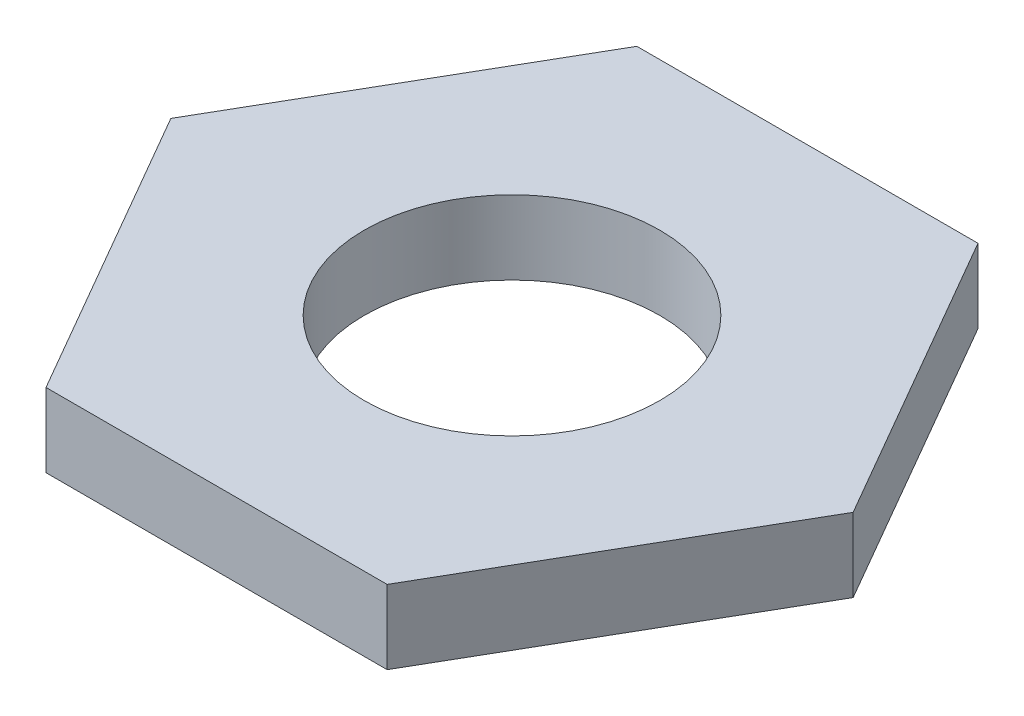
ISO-10303-21;
HEADER;
FILE_DESCRIPTION(('STEP AP214'),'2;1');
FILE_NAME('part.step','',(''),(''),'','','');
FILE_SCHEMA(('AUTOMOTIVE_DESIGN { 1 0 10303 214 1 1 1 1 }'));
ENDSEC;
DATA;
#1=APPLICATION_CONTEXT('core data for automotive mechanical design processes');
#2=APPLICATION_PROTOCOL_DEFINITION('international standard','automotive_design',2000,#1);
#3=PRODUCT_CONTEXT('',#1,'mechanical');
#4=PRODUCT('Part','Part','',(#3));
#5=PRODUCT_RELATED_PRODUCT_CATEGORY('part','',(#4));
#6=PRODUCT_DEFINITION_FORMATION('','',#4);
#7=PRODUCT_DEFINITION_CONTEXT('part definition',#1,'design');
#8=PRODUCT_DEFINITION('design','',#6,#7);
#9=PRODUCT_DEFINITION_SHAPE('','',#8);
#10=(LENGTH_UNIT() NAMED_UNIT(*) SI_UNIT(.MILLI.,.METRE.));
#11=(NAMED_UNIT(*) PLANE_ANGLE_UNIT() SI_UNIT($,.RADIAN.));
#12=(NAMED_UNIT(*) SI_UNIT($,.STERADIAN.) SOLID_ANGLE_UNIT());
#13=UNCERTAINTY_MEASURE_WITH_UNIT(LENGTH_MEASURE(1.E-05),#10,'distance_accuracy_value','');
#14=(GEOMETRIC_REPRESENTATION_CONTEXT(3) GLOBAL_UNCERTAINTY_ASSIGNED_CONTEXT((#13)) GLOBAL_UNIT_ASSIGNED_CONTEXT((#10,
#11,#12)) REPRESENTATION_CONTEXT('',''));
#15=CARTESIAN_POINT('',(0.,0.,0.));
#16=DIRECTION('',(0.,0.,1.));
#17=DIRECTION('',(1.,0.,0.));
#18=AXIS2_PLACEMENT_3D('',#15,#16,#17);
#19=CARTESIAN_POINT('',(0.,1.,0.));
#20=DIRECTION('',(0.,1.,0.));
#21=DIRECTION('',(0.,0.,1.));
#22=AXIS2_PLACEMENT_3D('',#19,#20,#21);
#23=PLANE('',#22);
#24=DIRECTION('',(-0.5,0.,-0.866025403784439));
#25=VECTOR('',#24,1.);
#26=CARTESIAN_POINT('',(4.61880215351701,1.,0.));
#27=LINE('',#26,#25);
#28=CARTESIAN_POINT('',(4.61880215351701,1.,0.));
#29=VERTEX_POINT('',#28);
#30=CARTESIAN_POINT('',(2.3094010767585,1.,-4.));
#31=VERTEX_POINT('',#30);
#32=EDGE_CURVE('E129',#29,#31,#27,.T.);
#33=ORIENTED_EDGE('',*,*,#32,.T.);
#34=DIRECTION('',(-1.,0.,0.));
#35=VECTOR('',#34,1.);
#36=CARTESIAN_POINT('',(2.3094010767585,1.,-4.));
#37=LINE('',#36,#35);
#38=CARTESIAN_POINT('',(-2.3094010767585,1.,-4.));
#39=VERTEX_POINT('',#38);
#40=EDGE_CURVE('E87',#31,#39,#37,.T.);
#41=ORIENTED_EDGE('',*,*,#40,.T.);
#42=DIRECTION('',(-0.5,0.,0.866025403784439));
#43=VECTOR('',#42,1.);
#44=CARTESIAN_POINT('',(-2.3094010767585,1.,-4.));
#45=LINE('',#44,#43);
#46=CARTESIAN_POINT('',(-4.618802153517,1.,0.));
#47=VERTEX_POINT('',#46);
#48=EDGE_CURVE('E100',#39,#47,#45,.T.);
#49=ORIENTED_EDGE('',*,*,#48,.T.);
#50=DIRECTION('',(0.5,0.,0.866025403784439));
#51=VECTOR('',#50,1.);
#52=CARTESIAN_POINT('',(-4.618802153517,1.,0.));
#53=LINE('',#52,#51);
#54=CARTESIAN_POINT('',(-2.3094010767585,1.,4.));
#55=VERTEX_POINT('',#54);
#56=EDGE_CURVE('E94',#47,#55,#53,.T.);
#57=ORIENTED_EDGE('',*,*,#56,.T.);
#58=DIRECTION('',(1.,0.,0.));
#59=VECTOR('',#58,1.);
#60=CARTESIAN_POINT('',(-2.3094010767585,1.,4.));
#61=LINE('',#60,#59);
#62=CARTESIAN_POINT('',(2.3094010767585,1.,4.));
#63=VERTEX_POINT('',#62);
#64=EDGE_CURVE('E98',#55,#63,#61,.T.);
#65=ORIENTED_EDGE('',*,*,#64,.T.);
#66=DIRECTION('',(0.5,0.,-0.866025403784439));
#67=VECTOR('',#66,1.);
#68=CARTESIAN_POINT('',(2.3094010767585,1.,4.));
#69=LINE('',#68,#67);
#70=EDGE_CURVE('E50',#63,#29,#69,.T.);
#71=ORIENTED_EDGE('',*,*,#70,.T.);
#72=EDGE_LOOP('',(#33,#41,#49,#57,#65,#71));
#73=FACE_BOUND('',#72,.T.);
#74=CARTESIAN_POINT('',(0.,1.,0.));
#75=DIRECTION('',(0.,1.,0.));
#76=DIRECTION('',(0.,0.,1.));
#77=AXIS2_PLACEMENT_3D('',#74,#75,#76);
#78=CIRCLE('',#77,2.);
#79=CARTESIAN_POINT('',(0.,1.,2.));
#80=VERTEX_POINT('',#79);
#81=EDGE_CURVE('E122',#80,#80,#78,.T.);
#82=ORIENTED_EDGE('',*,*,#81,.F.);
#83=EDGE_LOOP('',(#82));
#84=FACE_BOUND('',#83,.T.);
#85=ADVANCED_FACE('F33',(#73,#84),#23,.T.);
#86=CARTESIAN_POINT('',(0.,0.,0.));
#87=DIRECTION('',(0.,1.,0.));
#88=DIRECTION('',(0.,0.,1.));
#89=AXIS2_PLACEMENT_3D('',#86,#87,#88);
#90=PLANE('',#89);
#91=DIRECTION('',(-0.5,0.,-0.866025403784439));
#92=VECTOR('',#91,1.);
#93=CARTESIAN_POINT('',(4.61880215351701,0.,0.));
#94=LINE('',#93,#92);
#95=CARTESIAN_POINT('',(4.61880215351701,0.,0.));
#96=VERTEX_POINT('',#95);
#97=CARTESIAN_POINT('',(2.3094010767585,0.,-4.));
#98=VERTEX_POINT('',#97);
#99=EDGE_CURVE('E118',#96,#98,#94,.T.);
#100=ORIENTED_EDGE('',*,*,#99,.F.);
#101=DIRECTION('',(0.5,0.,-0.866025403784439));
#102=VECTOR('',#101,1.);
#103=CARTESIAN_POINT('',(2.3094010767585,0.,4.));
#104=LINE('',#103,#102);
#105=CARTESIAN_POINT('',(2.3094010767585,0.,4.));
#106=VERTEX_POINT('',#105);
#107=EDGE_CURVE('E79',#106,#96,#104,.T.);
#108=ORIENTED_EDGE('',*,*,#107,.F.);
#109=DIRECTION('',(1.,0.,0.));
#110=VECTOR('',#109,1.);
#111=CARTESIAN_POINT('',(-2.3094010767585,0.,4.));
#112=LINE('',#111,#110);
#113=CARTESIAN_POINT('',(-2.3094010767585,0.,4.));
#114=VERTEX_POINT('',#113);
#115=EDGE_CURVE('E73',#114,#106,#112,.T.);
#116=ORIENTED_EDGE('',*,*,#115,.F.);
#117=DIRECTION('',(0.5,0.,0.866025403784439));
#118=VECTOR('',#117,1.);
#119=CARTESIAN_POINT('',(-4.618802153517,0.,0.));
#120=LINE('',#119,#118);
#121=CARTESIAN_POINT('',(-4.618802153517,0.,0.));
#122=VERTEX_POINT('',#121);
#123=EDGE_CURVE('E108',#122,#114,#120,.T.);
#124=ORIENTED_EDGE('',*,*,#123,.F.);
#125=DIRECTION('',(-0.5,0.,0.866025403784439));
#126=VECTOR('',#125,1.);
#127=CARTESIAN_POINT('',(-2.3094010767585,0.,-4.));
#128=LINE('',#127,#126);
#129=CARTESIAN_POINT('',(-2.3094010767585,0.,-4.));
#130=VERTEX_POINT('',#129);
#131=EDGE_CURVE('E124',#130,#122,#128,.T.);
#132=ORIENTED_EDGE('',*,*,#131,.F.);
#133=DIRECTION('',(-1.,0.,0.));
#134=VECTOR('',#133,1.);
#135=CARTESIAN_POINT('',(2.3094010767585,0.,-4.));
#136=LINE('',#135,#134);
#137=EDGE_CURVE('E121',#98,#130,#136,.T.);
#138=ORIENTED_EDGE('',*,*,#137,.F.);
#139=EDGE_LOOP('',(#100,#108,#116,#124,#132,#138));
#140=FACE_BOUND('',#139,.T.);
#141=CARTESIAN_POINT('',(0.,0.,0.));
#142=DIRECTION('',(0.,1.,0.));
#143=DIRECTION('',(0.,0.,1.));
#144=AXIS2_PLACEMENT_3D('',#141,#142,#143);
#145=CIRCLE('',#144,2.);
#146=CARTESIAN_POINT('',(0.,0.,2.));
#147=VERTEX_POINT('',#146);
#148=EDGE_CURVE('E222',#147,#147,#145,.T.);
#149=ORIENTED_EDGE('',*,*,#148,.T.);
#150=EDGE_LOOP('',(#149));
#151=FACE_BOUND('',#150,.T.);
#152=ADVANCED_FACE('F138',(#140,#151),#90,.F.);
#153=CARTESIAN_POINT('',(4.61880215351701,1.,0.));
#154=DIRECTION('',(-0.866025403784439,0.,0.5));
#155=DIRECTION('',(0.5,0.,0.866025403784439));
#156=AXIS2_PLACEMENT_3D('',#153,#154,#155);
#157=PLANE('',#156);
#158=ORIENTED_EDGE('',*,*,#99,.T.);
#159=DIRECTION('',(0.,-1.,0.));
#160=VECTOR('',#159,1.);
#161=CARTESIAN_POINT('',(2.3094010767585,1.,-4.));
#162=LINE('',#161,#160);
#163=EDGE_CURVE('E11',#31,#98,#162,.T.);
#164=ORIENTED_EDGE('',*,*,#163,.F.);
#165=ORIENTED_EDGE('',*,*,#32,.F.);
#166=DIRECTION('',(0.,-1.,0.));
#167=VECTOR('',#166,1.);
#168=CARTESIAN_POINT('',(4.61880215351701,1.,0.));
#169=LINE('',#168,#167);
#170=EDGE_CURVE('E114',#29,#96,#169,.T.);
#171=ORIENTED_EDGE('',*,*,#170,.T.);
#172=EDGE_LOOP('',(#158,#164,#165,#171));
#173=FACE_BOUND('',#172,.T.);
#174=ADVANCED_FACE('F35',(#173),#157,.F.);
#175=CARTESIAN_POINT('',(2.3094010767585,1.,-4.));
#176=DIRECTION('',(0.,0.,1.));
#177=DIRECTION('',(1.,0.,0.));
#178=AXIS2_PLACEMENT_3D('',#175,#176,#177);
#179=PLANE('',#178);
#180=ORIENTED_EDGE('',*,*,#137,.T.);
#181=DIRECTION('',(0.,-1.,0.));
#182=VECTOR('',#181,1.);
#183=CARTESIAN_POINT('',(-2.3094010767585,1.,-4.));
#184=LINE('',#183,#182);
#185=EDGE_CURVE('E42',#39,#130,#184,.T.);
#186=ORIENTED_EDGE('',*,*,#185,.F.);
#187=ORIENTED_EDGE('',*,*,#40,.F.);
#188=ORIENTED_EDGE('',*,*,#163,.T.);
#189=EDGE_LOOP('',(#180,#186,#187,#188));
#190=FACE_BOUND('',#189,.T.);
#191=ADVANCED_FACE('F163',(#190),#179,.F.);
#192=CARTESIAN_POINT('',(-2.3094010767585,1.,-4.));
#193=DIRECTION('',(0.866025403784439,0.,0.5));
#194=DIRECTION('',(0.5,0.,-0.866025403784439));
#195=AXIS2_PLACEMENT_3D('',#192,#193,#194);
#196=PLANE('',#195);
#197=ORIENTED_EDGE('',*,*,#131,.T.);
#198=DIRECTION('',(0.,-1.,0.));
#199=VECTOR('',#198,1.);
#200=CARTESIAN_POINT('',(-4.618802153517,1.,0.));
#201=LINE('',#200,#199);
#202=EDGE_CURVE('E109',#47,#122,#201,.T.);
#203=ORIENTED_EDGE('',*,*,#202,.F.);
#204=ORIENTED_EDGE('',*,*,#48,.F.);
#205=ORIENTED_EDGE('',*,*,#185,.T.);
#206=EDGE_LOOP('',(#197,#203,#204,#205));
#207=FACE_BOUND('',#206,.T.);
#208=ADVANCED_FACE('F135',(#207),#196,.F.);
#209=CARTESIAN_POINT('',(-4.618802153517,1.,0.));
#210=DIRECTION('',(0.866025403784439,0.,-0.5));
#211=DIRECTION('',(-0.5,0.,-0.866025403784439));
#212=AXIS2_PLACEMENT_3D('',#209,#210,#211);
#213=PLANE('',#212);
#214=ORIENTED_EDGE('',*,*,#123,.T.);
#215=DIRECTION('',(0.,-1.,0.));
#216=VECTOR('',#215,1.);
#217=CARTESIAN_POINT('',(-2.3094010767585,1.,4.));
#218=LINE('',#217,#216);
#219=EDGE_CURVE('E105',#55,#114,#218,.T.);
#220=ORIENTED_EDGE('',*,*,#219,.F.);
#221=ORIENTED_EDGE('',*,*,#56,.F.);
#222=ORIENTED_EDGE('',*,*,#202,.T.);
#223=EDGE_LOOP('',(#214,#220,#221,#222));
#224=FACE_BOUND('',#223,.T.);
#225=ADVANCED_FACE('F106',(#224),#213,.F.);
#226=CARTESIAN_POINT('',(-2.3094010767585,1.,4.));
#227=DIRECTION('',(0.,0.,-1.));
#228=DIRECTION('',(-1.,0.,0.));
#229=AXIS2_PLACEMENT_3D('',#226,#227,#228);
#230=PLANE('',#229);
#231=ORIENTED_EDGE('',*,*,#115,.T.);
#232=DIRECTION('',(0.,-1.,0.));
#233=VECTOR('',#232,1.);
#234=CARTESIAN_POINT('',(2.3094010767585,1.,4.));
#235=LINE('',#234,#233);
#236=EDGE_CURVE('E110',#63,#106,#235,.T.);
#237=ORIENTED_EDGE('',*,*,#236,.F.);
#238=ORIENTED_EDGE('',*,*,#64,.F.);
#239=ORIENTED_EDGE('',*,*,#219,.T.);
#240=EDGE_LOOP('',(#231,#237,#238,#239));
#241=FACE_BOUND('',#240,.T.);
#242=ADVANCED_FACE('F112',(#241),#230,.F.);
#243=CARTESIAN_POINT('',(2.3094010767585,1.,4.));
#244=DIRECTION('',(-0.866025403784439,0.,-0.5));
#245=DIRECTION('',(-0.5,0.,0.866025403784439));
#246=AXIS2_PLACEMENT_3D('',#243,#244,#245);
#247=PLANE('',#246);
#248=ORIENTED_EDGE('',*,*,#107,.T.);
#249=ORIENTED_EDGE('',*,*,#170,.F.);
#250=ORIENTED_EDGE('',*,*,#70,.F.);
#251=ORIENTED_EDGE('',*,*,#236,.T.);
#252=EDGE_LOOP('',(#248,#249,#250,#251));
#253=FACE_BOUND('',#252,.T.);
#254=ADVANCED_FACE('F143',(#253),#247,.F.);
#255=CARTESIAN_POINT('',(0.,1.,0.));
#256=DIRECTION('',(0.,-1.,0.));
#257=DIRECTION('',(0.,0.,-1.));
#258=AXIS2_PLACEMENT_3D('',#255,#256,#257);
#259=CYLINDRICAL_SURFACE('',#258,2.);
#260=ORIENTED_EDGE('',*,*,#81,.T.);
#261=EDGE_LOOP('',(#260));
#262=FACE_BOUND('',#261,.T.);
#263=ORIENTED_EDGE('',*,*,#148,.F.);
#264=EDGE_LOOP('',(#263));
#265=FACE_BOUND('',#264,.T.);
#266=ADVANCED_FACE('F145',(#262,#265),#259,.F.);
#267=CLOSED_SHELL('',(#85,#152,#174,#191,#208,#225,#242,#254,#266));
#268=MANIFOLD_SOLID_BREP('B2',#267);
#269=ADVANCED_BREP_SHAPE_REPRESENTATION('',(#18,#268),#14);
#270=SHAPE_DEFINITION_REPRESENTATION(#9,#269);
ENDSEC;
END-ISO-10303-21;
